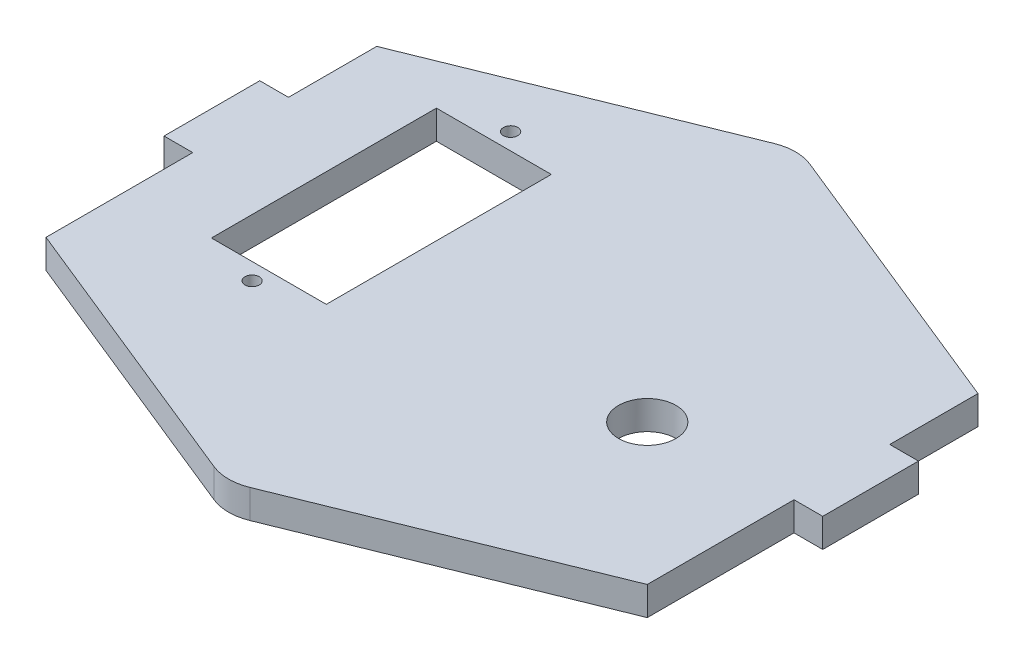
ISO-10303-21;
HEADER;
FILE_DESCRIPTION(('STEP AP214'),'2;1');
FILE_NAME('part.step','',(''),(''),'','','');
FILE_SCHEMA(('AUTOMOTIVE_DESIGN { 1 0 10303 214 1 1 1 1 }'));
ENDSEC;
DATA;
#1=APPLICATION_CONTEXT('core data for automotive mechanical design processes');
#2=APPLICATION_PROTOCOL_DEFINITION('international standard','automotive_design',2000,#1);
#3=PRODUCT_CONTEXT('',#1,'mechanical');
#4=PRODUCT('Part','Part','',(#3));
#5=PRODUCT_RELATED_PRODUCT_CATEGORY('part','',(#4));
#6=PRODUCT_DEFINITION_FORMATION('','',#4);
#7=PRODUCT_DEFINITION_CONTEXT('part definition',#1,'design');
#8=PRODUCT_DEFINITION('design','',#6,#7);
#9=PRODUCT_DEFINITION_SHAPE('','',#8);
#10=(LENGTH_UNIT() NAMED_UNIT(*) SI_UNIT(.MILLI.,.METRE.));
#11=(NAMED_UNIT(*) PLANE_ANGLE_UNIT() SI_UNIT($,.RADIAN.));
#12=(NAMED_UNIT(*) SI_UNIT($,.STERADIAN.) SOLID_ANGLE_UNIT());
#13=UNCERTAINTY_MEASURE_WITH_UNIT(LENGTH_MEASURE(1.E-05),#10,'distance_accuracy_value','');
#14=(GEOMETRIC_REPRESENTATION_CONTEXT(3) GLOBAL_UNCERTAINTY_ASSIGNED_CONTEXT((#13)) GLOBAL_UNIT_ASSIGNED_CONTEXT((#10,
#11,#12)) REPRESENTATION_CONTEXT('',''));
#15=CARTESIAN_POINT('',(0.,0.,0.));
#16=DIRECTION('',(0.,0.,1.));
#17=DIRECTION('',(1.,0.,0.));
#18=AXIS2_PLACEMENT_3D('',#15,#16,#17);
#19=CARTESIAN_POINT('',(31.4,-0.01,-16.055));
#20=DIRECTION('',(-1.,0.,0.));
#21=DIRECTION('',(0.,0.,1.));
#22=AXIS2_PLACEMENT_3D('',#19,#20,#21);
#23=PLANE('',#22);
#24=DIRECTION('',(0.,0.,1.));
#25=VECTOR('',#24,1.);
#26=CARTESIAN_POINT('',(31.4,0.,-16.055));
#27=LINE('',#26,#25);
#28=CARTESIAN_POINT('',(31.4,0.,-17.2711337209302));
#29=VERTEX_POINT('',#28);
#30=CARTESIAN_POINT('',(31.4,0.,-8.05500000000001));
#31=VERTEX_POINT('',#30);
#32=EDGE_CURVE('E279',#29,#31,#27,.T.);
#33=ORIENTED_EDGE('',*,*,#32,.F.);
#34=DIRECTION('',(0.,-1.,0.));
#35=VECTOR('',#34,1.);
#36=CARTESIAN_POINT('',(31.4,3.,-17.2711337209302));
#37=LINE('',#36,#35);
#38=CARTESIAN_POINT('',(31.4,3.,-17.2711337209302));
#39=VERTEX_POINT('',#38);
#40=EDGE_CURVE('E200',#39,#29,#37,.T.);
#41=ORIENTED_EDGE('',*,*,#40,.F.);
#42=DIRECTION('',(0.,0.,1.));
#43=VECTOR('',#42,1.);
#44=CARTESIAN_POINT('',(31.4,3.,-16.055));
#45=LINE('',#44,#43);
#46=CARTESIAN_POINT('',(31.4,3.,-8.05500000000001));
#47=VERTEX_POINT('',#46);
#48=EDGE_CURVE('E278',#39,#47,#45,.T.);
#49=ORIENTED_EDGE('',*,*,#48,.T.);
#50=DIRECTION('',(0.,1.,0.));
#51=VECTOR('',#50,1.);
#52=CARTESIAN_POINT('',(31.4,0.,-8.05500000000001));
#53=LINE('',#52,#51);
#54=EDGE_CURVE('E270',#31,#47,#53,.T.);
#55=ORIENTED_EDGE('',*,*,#54,.F.);
#56=EDGE_LOOP('',(#33,#41,#49,#55));
#57=FACE_BOUND('',#56,.T.);
#58=ADVANCED_FACE('F34',(#57),#23,.F.);
#59=CARTESIAN_POINT('',(31.4,-0.01,17.2711337209302));
#60=DIRECTION('',(-1.,0.,0.));
#61=DIRECTION('',(0.,0.,1.));
#62=AXIS2_PLACEMENT_3D('',#59,#60,#61);
#63=PLANE('',#62);
#64=DIRECTION('',(0.,1.,0.));
#65=VECTOR('',#64,1.);
#66=CARTESIAN_POINT('',(31.4,-0.01,17.2711337209302));
#67=LINE('',#66,#65);
#68=CARTESIAN_POINT('',(31.4,0.,17.2711337209302));
#69=VERTEX_POINT('',#68);
#70=CARTESIAN_POINT('',(31.4,3.,17.2711337209302));
#71=VERTEX_POINT('',#70);
#72=EDGE_CURVE('E193',#69,#71,#67,.T.);
#73=ORIENTED_EDGE('',*,*,#72,.F.);
#74=DIRECTION('',(0.,0.,1.));
#75=VECTOR('',#74,1.);
#76=CARTESIAN_POINT('',(31.4,0.,16.055));
#77=LINE('',#76,#75);
#78=CARTESIAN_POINT('',(31.4,0.,1.94499999999999));
#79=VERTEX_POINT('',#78);
#80=EDGE_CURVE('E179',#79,#69,#77,.T.);
#81=ORIENTED_EDGE('',*,*,#80,.F.);
#82=DIRECTION('',(0.,1.,0.));
#83=VECTOR('',#82,1.);
#84=CARTESIAN_POINT('',(31.4,0.,1.94499999999999));
#85=LINE('',#84,#83);
#86=CARTESIAN_POINT('',(31.4,3.,1.94499999999999));
#87=VERTEX_POINT('',#86);
#88=EDGE_CURVE('E282',#79,#87,#85,.T.);
#89=ORIENTED_EDGE('',*,*,#88,.T.);
#90=DIRECTION('',(0.,0.,1.));
#91=VECTOR('',#90,1.);
#92=CARTESIAN_POINT('',(31.4,3.,16.055));
#93=LINE('',#92,#91);
#94=EDGE_CURVE('E196',#87,#71,#93,.T.);
#95=ORIENTED_EDGE('',*,*,#94,.T.);
#96=EDGE_LOOP('',(#73,#81,#89,#95));
#97=FACE_BOUND('',#96,.T.);
#98=ADVANCED_FACE('F194',(#97),#63,.F.);
#99=CARTESIAN_POINT('',(-31.4,-0.01,17.2711337209302));
#100=DIRECTION('',(1.,0.,0.));
#101=DIRECTION('',(0.,0.,-1.));
#102=AXIS2_PLACEMENT_3D('',#99,#100,#101);
#103=PLANE('',#102);
#104=DIRECTION('',(0.,0.,-1.));
#105=VECTOR('',#104,1.);
#106=CARTESIAN_POINT('',(-31.4,0.,16.055));
#107=LINE('',#106,#105);
#108=CARTESIAN_POINT('',(-31.4,0.,17.2711337209302));
#109=VERTEX_POINT('',#108);
#110=CARTESIAN_POINT('',(-31.4,0.,1.94499999999999));
#111=VERTEX_POINT('',#110);
#112=EDGE_CURVE('E303',#109,#111,#107,.T.);
#113=ORIENTED_EDGE('',*,*,#112,.F.);
#114=DIRECTION('',(0.,1.,0.));
#115=VECTOR('',#114,1.);
#116=CARTESIAN_POINT('',(-31.4,-0.01,17.2711337209302));
#117=LINE('',#116,#115);
#118=CARTESIAN_POINT('',(-31.4,3.,17.2711337209302));
#119=VERTEX_POINT('',#118);
#120=EDGE_CURVE('E201',#109,#119,#117,.T.);
#121=ORIENTED_EDGE('',*,*,#120,.T.);
#122=DIRECTION('',(0.,0.,-1.));
#123=VECTOR('',#122,1.);
#124=CARTESIAN_POINT('',(-31.4,3.,16.055));
#125=LINE('',#124,#123);
#126=CARTESIAN_POINT('',(-31.4,3.,1.94499999999999));
#127=VERTEX_POINT('',#126);
#128=EDGE_CURVE('E302',#119,#127,#125,.T.);
#129=ORIENTED_EDGE('',*,*,#128,.T.);
#130=DIRECTION('',(0.,1.,0.));
#131=VECTOR('',#130,1.);
#132=CARTESIAN_POINT('',(-31.4,0.,1.94499999999999));
#133=LINE('',#132,#131);
#134=EDGE_CURVE('E294',#111,#127,#133,.T.);
#135=ORIENTED_EDGE('',*,*,#134,.F.);
#136=EDGE_LOOP('',(#113,#121,#129,#135));
#137=FACE_BOUND('',#136,.T.);
#138=ADVANCED_FACE('F400',(#137),#103,.F.);
#139=CARTESIAN_POINT('',(-31.4,-0.01,-16.055));
#140=DIRECTION('',(1.,0.,0.));
#141=DIRECTION('',(0.,0.,-1.));
#142=AXIS2_PLACEMENT_3D('',#139,#140,#141);
#143=PLANE('',#142);
#144=DIRECTION('',(0.,1.,0.));
#145=VECTOR('',#144,1.);
#146=CARTESIAN_POINT('',(-31.4,-0.01,-17.2711337209302));
#147=LINE('',#146,#145);
#148=CARTESIAN_POINT('',(-31.4,0.,-17.2711337209302));
#149=VERTEX_POINT('',#148);
#150=CARTESIAN_POINT('',(-31.4,3.,-17.2711337209302));
#151=VERTEX_POINT('',#150);
#152=EDGE_CURVE('E229',#149,#151,#147,.T.);
#153=ORIENTED_EDGE('',*,*,#152,.F.);
#154=DIRECTION('',(0.,0.,-1.));
#155=VECTOR('',#154,1.);
#156=CARTESIAN_POINT('',(-31.4,0.,-16.055));
#157=LINE('',#156,#155);
#158=CARTESIAN_POINT('',(-31.4,0.,-8.05500000000001));
#159=VERTEX_POINT('',#158);
#160=EDGE_CURVE('E313',#159,#149,#157,.T.);
#161=ORIENTED_EDGE('',*,*,#160,.F.);
#162=DIRECTION('',(0.,1.,0.));
#163=VECTOR('',#162,1.);
#164=CARTESIAN_POINT('',(-31.4,0.,-8.05500000000001));
#165=LINE('',#164,#163);
#166=CARTESIAN_POINT('',(-31.4,3.,-8.05500000000001));
#167=VERTEX_POINT('',#166);
#168=EDGE_CURVE('E306',#159,#167,#165,.T.);
#169=ORIENTED_EDGE('',*,*,#168,.T.);
#170=DIRECTION('',(0.,0.,-1.));
#171=VECTOR('',#170,1.);
#172=CARTESIAN_POINT('',(-31.4,3.,-16.055));
#173=LINE('',#172,#171);
#174=EDGE_CURVE('E315',#167,#151,#173,.T.);
#175=ORIENTED_EDGE('',*,*,#174,.T.);
#176=EDGE_LOOP('',(#153,#161,#169,#175));
#177=FACE_BOUND('',#176,.T.);
#178=ADVANCED_FACE('F370',(#177),#143,.F.);
#179=CARTESIAN_POINT('',(-10.7,0.,-14.805));
#180=DIRECTION('',(0.,0.,-1.));
#181=DIRECTION('',(-1.,0.,0.));
#182=AXIS2_PLACEMENT_3D('',#179,#180,#181);
#183=PLANE('',#182);
#184=DIRECTION('',(-1.,0.,0.));
#185=VECTOR('',#184,1.);
#186=CARTESIAN_POINT('',(-10.7,3.,-14.805));
#187=LINE('',#186,#185);
#188=CARTESIAN_POINT('',(-10.7,3.,-14.805));
#189=VERTEX_POINT('',#188);
#190=CARTESIAN_POINT('',(-22.7,3.,-14.805));
#191=VERTEX_POINT('',#190);
#192=EDGE_CURVE('E329',#189,#191,#187,.T.);
#193=ORIENTED_EDGE('',*,*,#192,.T.);
#194=DIRECTION('',(0.,1.,0.));
#195=VECTOR('',#194,1.);
#196=CARTESIAN_POINT('',(-22.7,0.,-14.805));
#197=LINE('',#196,#195);
#198=CARTESIAN_POINT('',(-22.7,0.,-14.805));
#199=VERTEX_POINT('',#198);
#200=EDGE_CURVE('E75',#199,#191,#197,.T.);
#201=ORIENTED_EDGE('',*,*,#200,.F.);
#202=DIRECTION('',(-1.,0.,0.));
#203=VECTOR('',#202,1.);
#204=CARTESIAN_POINT('',(-10.7,0.,-14.805));
#205=LINE('',#204,#203);
#206=CARTESIAN_POINT('',(-10.7,0.,-14.805));
#207=VERTEX_POINT('',#206);
#208=EDGE_CURVE('E325',#207,#199,#205,.T.);
#209=ORIENTED_EDGE('',*,*,#208,.F.);
#210=DIRECTION('',(0.,1.,0.));
#211=VECTOR('',#210,1.);
#212=CARTESIAN_POINT('',(-10.7,0.,-14.805));
#213=LINE('',#212,#211);
#214=EDGE_CURVE('E65',#207,#189,#213,.T.);
#215=ORIENTED_EDGE('',*,*,#214,.T.);
#216=EDGE_LOOP('',(#193,#201,#209,#215));
#217=FACE_BOUND('',#216,.T.);
#218=ADVANCED_FACE('F462',(#217),#183,.F.);
#219=CARTESIAN_POINT('',(-10.7,0.,8.69499999999999));
#220=DIRECTION('',(1.,0.,0.));
#221=DIRECTION('',(0.,0.,-1.));
#222=AXIS2_PLACEMENT_3D('',#219,#220,#221);
#223=PLANE('',#222);
#224=DIRECTION('',(0.,0.,-1.));
#225=VECTOR('',#224,1.);
#226=CARTESIAN_POINT('',(-10.7,3.,8.69499999999999));
#227=LINE('',#226,#225);
#228=CARTESIAN_POINT('',(-10.7,3.,8.69499999999999));
#229=VERTEX_POINT('',#228);
#230=EDGE_CURVE('E331',#229,#189,#227,.T.);
#231=ORIENTED_EDGE('',*,*,#230,.T.);
#232=ORIENTED_EDGE('',*,*,#214,.F.);
#233=DIRECTION('',(0.,0.,-1.));
#234=VECTOR('',#233,1.);
#235=CARTESIAN_POINT('',(-10.7,0.,8.69499999999999));
#236=LINE('',#235,#234);
#237=CARTESIAN_POINT('',(-10.7,0.,8.69499999999999));
#238=VERTEX_POINT('',#237);
#239=EDGE_CURVE('E341',#238,#207,#236,.T.);
#240=ORIENTED_EDGE('',*,*,#239,.F.);
#241=DIRECTION('',(0.,1.,0.));
#242=VECTOR('',#241,1.);
#243=CARTESIAN_POINT('',(-10.7,0.,8.69499999999999));
#244=LINE('',#243,#242);
#245=EDGE_CURVE('E53',#238,#229,#244,.T.);
#246=ORIENTED_EDGE('',*,*,#245,.T.);
#247=EDGE_LOOP('',(#231,#232,#240,#246));
#248=FACE_BOUND('',#247,.T.);
#249=ADVANCED_FACE('F458',(#248),#223,.F.);
#250=CARTESIAN_POINT('',(-10.7,0.,8.69499999999999));
#251=DIRECTION('',(0.,0.,1.));
#252=DIRECTION('',(1.,0.,0.));
#253=AXIS2_PLACEMENT_3D('',#250,#251,#252);
#254=PLANE('',#253);
#255=DIRECTION('',(1.,0.,0.));
#256=VECTOR('',#255,1.);
#257=CARTESIAN_POINT('',(-10.7,3.,8.69499999999999));
#258=LINE('',#257,#256);
#259=CARTESIAN_POINT('',(-22.7,3.,8.69499999999999));
#260=VERTEX_POINT('',#259);
#261=EDGE_CURVE('E334',#260,#229,#258,.T.);
#262=ORIENTED_EDGE('',*,*,#261,.T.);
#263=ORIENTED_EDGE('',*,*,#245,.F.);
#264=DIRECTION('',(1.,0.,0.));
#265=VECTOR('',#264,1.);
#266=CARTESIAN_POINT('',(-10.7,0.,8.69499999999999));
#267=LINE('',#266,#265);
#268=CARTESIAN_POINT('',(-22.7,0.,8.69499999999999));
#269=VERTEX_POINT('',#268);
#270=EDGE_CURVE('E344',#269,#238,#267,.T.);
#271=ORIENTED_EDGE('',*,*,#270,.F.);
#272=DIRECTION('',(0.,1.,0.));
#273=VECTOR('',#272,1.);
#274=CARTESIAN_POINT('',(-22.7,0.,8.69499999999999));
#275=LINE('',#274,#273);
#276=EDGE_CURVE('E72',#269,#260,#275,.T.);
#277=ORIENTED_EDGE('',*,*,#276,.T.);
#278=EDGE_LOOP('',(#262,#263,#271,#277));
#279=FACE_BOUND('',#278,.T.);
#280=ADVANCED_FACE('F455',(#279),#254,.F.);
#281=CARTESIAN_POINT('',(-22.7,0.,8.69499999999999));
#282=DIRECTION('',(-1.,0.,0.));
#283=DIRECTION('',(0.,0.,1.));
#284=AXIS2_PLACEMENT_3D('',#281,#282,#283);
#285=PLANE('',#284);
#286=DIRECTION('',(0.,0.,1.));
#287=VECTOR('',#286,1.);
#288=CARTESIAN_POINT('',(-22.7,3.,8.69499999999999));
#289=LINE('',#288,#287);
#290=EDGE_CURVE('E336',#191,#260,#289,.T.);
#291=ORIENTED_EDGE('',*,*,#290,.T.);
#292=ORIENTED_EDGE('',*,*,#276,.F.);
#293=DIRECTION('',(0.,0.,1.));
#294=VECTOR('',#293,1.);
#295=CARTESIAN_POINT('',(-22.7,0.,8.69499999999999));
#296=LINE('',#295,#294);
#297=EDGE_CURVE('E332',#199,#269,#296,.T.);
#298=ORIENTED_EDGE('',*,*,#297,.F.);
#299=ORIENTED_EDGE('',*,*,#200,.T.);
#300=EDGE_LOOP('',(#291,#292,#298,#299));
#301=FACE_BOUND('',#300,.T.);
#302=ADVANCED_FACE('F452',(#301),#285,.F.);
#303=CARTESIAN_POINT('',(-16.7,0.,-16.555));
#304=DIRECTION('',(0.,1.,0.));
#305=DIRECTION('',(0.,0.,1.));
#306=AXIS2_PLACEMENT_3D('',#303,#304,#305);
#307=CYLINDRICAL_SURFACE('',#306,0.750000000000002);
#308=CARTESIAN_POINT('',(-16.7,0.,-16.555));
#309=DIRECTION('',(0.,1.,0.));
#310=DIRECTION('',(0.,0.,1.));
#311=AXIS2_PLACEMENT_3D('',#308,#309,#310);
#312=CIRCLE('',#311,0.750000000000002);
#313=CARTESIAN_POINT('',(-16.7,0.,-15.805));
#314=VERTEX_POINT('',#313);
#315=EDGE_CURVE('E338',#314,#314,#312,.T.);
#316=ORIENTED_EDGE('',*,*,#315,.F.);
#317=EDGE_LOOP('',(#316));
#318=FACE_BOUND('',#317,.T.);
#319=CARTESIAN_POINT('',(-16.7,3.,-16.555));
#320=DIRECTION('',(0.,1.,0.));
#321=DIRECTION('',(0.,0.,1.));
#322=AXIS2_PLACEMENT_3D('',#319,#320,#321);
#323=CIRCLE('',#322,0.750000000000002);
#324=CARTESIAN_POINT('',(-16.7,3.,-15.805));
#325=VERTEX_POINT('',#324);
#326=EDGE_CURVE('E349',#325,#325,#323,.T.);
#327=ORIENTED_EDGE('',*,*,#326,.T.);
#328=EDGE_LOOP('',(#327));
#329=FACE_BOUND('',#328,.T.);
#330=ADVANCED_FACE('F361',(#318,#329),#307,.F.);
#331=CARTESIAN_POINT('',(-16.7,0.,10.445));
#332=DIRECTION('',(0.,1.,0.));
#333=DIRECTION('',(0.,0.,1.));
#334=AXIS2_PLACEMENT_3D('',#331,#332,#333);
#335=CYLINDRICAL_SURFACE('',#334,0.750000000000002);
#336=CARTESIAN_POINT('',(-16.7,0.,10.445));
#337=DIRECTION('',(0.,1.,0.));
#338=DIRECTION('',(0.,0.,-1.));
#339=AXIS2_PLACEMENT_3D('',#336,#337,#338);
#340=CIRCLE('',#339,0.750000000000002);
#341=CARTESIAN_POINT('',(-16.7,0.,9.69499999999999));
#342=VERTEX_POINT('',#341);
#343=EDGE_CURVE('E44',#342,#342,#340,.T.);
#344=ORIENTED_EDGE('',*,*,#343,.F.);
#345=EDGE_LOOP('',(#344));
#346=FACE_BOUND('',#345,.T.);
#347=CARTESIAN_POINT('',(-16.7,3.,10.445));
#348=DIRECTION('',(0.,1.,0.));
#349=DIRECTION('',(0.,0.,-1.));
#350=AXIS2_PLACEMENT_3D('',#347,#348,#349);
#351=CIRCLE('',#350,0.750000000000002);
#352=CARTESIAN_POINT('',(-16.7,3.,9.69499999999999));
#353=VERTEX_POINT('',#352);
#354=EDGE_CURVE('E11',#353,#353,#351,.T.);
#355=ORIENTED_EDGE('',*,*,#354,.T.);
#356=EDGE_LOOP('',(#355));
#357=FACE_BOUND('',#356,.T.);
#358=ADVANCED_FACE('F358',(#346,#357),#335,.F.);
#359=CARTESIAN_POINT('',(0.,3.,-30.));
#360=DIRECTION('',(-0.375683221710316,0.,0.926748141042299));
#361=DIRECTION('',(0.9267481410423,0.,0.375683221710316));
#362=AXIS2_PLACEMENT_3D('',#359,#360,#361);
#363=PLANE('',#362);
#364=DIRECTION('',(-0.926748141042299,0.,-0.375683221710316));
#365=VECTOR('',#364,1.);
#366=CARTESIAN_POINT('',(0.,3.,-30.));
#367=LINE('',#366,#365);
#368=CARTESIAN_POINT('',(1.8784161085516,3.,-29.238531609484));
#369=VERTEX_POINT('',#368);
#370=EDGE_CURVE('E38',#39,#369,#367,.T.);
#371=ORIENTED_EDGE('',*,*,#370,.F.);
#372=ORIENTED_EDGE('',*,*,#40,.T.);
#373=DIRECTION('',(-0.926748141042299,0.,-0.375683221710316));
#374=VECTOR('',#373,1.);
#375=CARTESIAN_POINT('',(0.,0.,-30.));
#376=LINE('',#375,#374);
#377=CARTESIAN_POINT('',(1.8784161085516,0.,-29.238531609484));
#378=VERTEX_POINT('',#377);
#379=EDGE_CURVE('E212',#29,#378,#376,.T.);
#380=ORIENTED_EDGE('',*,*,#379,.T.);
#381=DIRECTION('',(0.,-1.,0.));
#382=VECTOR('',#381,1.);
#383=CARTESIAN_POINT('',(1.8784161085516,3.,-29.238531609484));
#384=LINE('',#383,#382);
#385=EDGE_CURVE('E231',#378,#369,#384,.F.);
#386=ORIENTED_EDGE('',*,*,#385,.T.);
#387=EDGE_LOOP('',(#371,#372,#380,#386));
#388=FACE_BOUND('',#387,.T.);
#389=ADVANCED_FACE('F237',(#388),#363,.F.);
#390=CARTESIAN_POINT('',(0.,3.,-24.6047909042725));
#391=DIRECTION('',(0.,-1.,0.));
#392=DIRECTION('',(0.,0.,-1.));
#393=AXIS2_PLACEMENT_3D('',#390,#391,#392);
#394=CYLINDRICAL_SURFACE('',#393,5.);
#395=CARTESIAN_POINT('',(0.,3.,-24.6047909042725));
#396=DIRECTION('',(0.,-1.,0.));
#397=DIRECTION('',(0.,0.,-1.));
#398=AXIS2_PLACEMENT_3D('',#395,#396,#397);
#399=CIRCLE('',#398,5.);
#400=CARTESIAN_POINT('',(-1.87841610855156,3.,-29.238531609484));
#401=VERTEX_POINT('',#400);
#402=EDGE_CURVE('E250',#369,#401,#399,.F.);
#403=ORIENTED_EDGE('',*,*,#402,.F.);
#404=ORIENTED_EDGE('',*,*,#385,.F.);
#405=CARTESIAN_POINT('',(0.,0.,-24.6047909042725));
#406=DIRECTION('',(0.,-1.,0.));
#407=DIRECTION('',(0.,0.,-1.));
#408=AXIS2_PLACEMENT_3D('',#405,#406,#407);
#409=CIRCLE('',#408,5.);
#410=CARTESIAN_POINT('',(-1.87841610855156,0.,-29.238531609484));
#411=VERTEX_POINT('',#410);
#412=EDGE_CURVE('E243',#411,#378,#409,.T.);
#413=ORIENTED_EDGE('',*,*,#412,.F.);
#414=DIRECTION('',(0.,-1.,0.));
#415=VECTOR('',#414,1.);
#416=CARTESIAN_POINT('',(-1.87841610855156,3.,-29.238531609484));
#417=LINE('',#416,#415);
#418=EDGE_CURVE('E251',#401,#411,#417,.T.);
#419=ORIENTED_EDGE('',*,*,#418,.F.);
#420=EDGE_LOOP('',(#403,#404,#413,#419));
#421=FACE_BOUND('',#420,.T.);
#422=ADVANCED_FACE('F249',(#421),#394,.T.);
#423=CARTESIAN_POINT('',(-34.4,3.,-16.055));
#424=DIRECTION('',(0.375683221710316,0.,0.926748141042299));
#425=DIRECTION('',(0.926748141042299,0.,-0.375683221710316));
#426=AXIS2_PLACEMENT_3D('',#423,#424,#425);
#427=PLANE('',#426);
#428=DIRECTION('',(-0.926748141042299,0.,0.375683221710316));
#429=VECTOR('',#428,1.);
#430=CARTESIAN_POINT('',(-34.4,0.,-16.055));
#431=LINE('',#430,#429);
#432=EDGE_CURVE('E223',#411,#149,#431,.T.);
#433=ORIENTED_EDGE('',*,*,#432,.T.);
#434=ORIENTED_EDGE('',*,*,#152,.T.);
#435=DIRECTION('',(-0.926748141042299,0.,0.375683221710316));
#436=VECTOR('',#435,1.);
#437=CARTESIAN_POINT('',(-34.4,3.,-16.055));
#438=LINE('',#437,#436);
#439=EDGE_CURVE('E226',#401,#151,#438,.T.);
#440=ORIENTED_EDGE('',*,*,#439,.F.);
#441=ORIENTED_EDGE('',*,*,#418,.T.);
#442=EDGE_LOOP('',(#433,#434,#440,#441));
#443=FACE_BOUND('',#442,.T.);
#444=ADVANCED_FACE('F420',(#443),#427,.F.);
#445=CARTESIAN_POINT('',(-34.4,3.,16.055));
#446=DIRECTION('',(1.,0.,0.));
#447=DIRECTION('',(0.,0.,-1.));
#448=AXIS2_PLACEMENT_3D('',#445,#446,#447);
#449=PLANE('',#448);
#450=DIRECTION('',(0.,0.,1.));
#451=VECTOR('',#450,1.);
#452=CARTESIAN_POINT('',(-34.4,3.,16.055));
#453=LINE('',#452,#451);
#454=CARTESIAN_POINT('',(-34.4,3.,-8.05500000000001));
#455=VERTEX_POINT('',#454);
#456=CARTESIAN_POINT('',(-34.4,3.,1.94499999999999));
#457=VERTEX_POINT('',#456);
#458=EDGE_CURVE('E219',#455,#457,#453,.T.);
#459=ORIENTED_EDGE('',*,*,#458,.F.);
#460=DIRECTION('',(0.,1.,0.));
#461=VECTOR('',#460,1.);
#462=CARTESIAN_POINT('',(-34.4,0.,-8.05500000000001));
#463=LINE('',#462,#461);
#464=CARTESIAN_POINT('',(-34.4,0.,-8.05500000000001));
#465=VERTEX_POINT('',#464);
#466=EDGE_CURVE('E311',#465,#455,#463,.T.);
#467=ORIENTED_EDGE('',*,*,#466,.F.);
#468=DIRECTION('',(0.,0.,1.));
#469=VECTOR('',#468,1.);
#470=CARTESIAN_POINT('',(-34.4,0.,16.055));
#471=LINE('',#470,#469);
#472=CARTESIAN_POINT('',(-34.4,0.,1.94499999999999));
#473=VERTEX_POINT('',#472);
#474=EDGE_CURVE('E210',#465,#473,#471,.T.);
#475=ORIENTED_EDGE('',*,*,#474,.T.);
#476=DIRECTION('',(0.,1.,0.));
#477=VECTOR('',#476,1.);
#478=CARTESIAN_POINT('',(-34.4,0.,1.94499999999999));
#479=LINE('',#478,#477);
#480=EDGE_CURVE('E291',#473,#457,#479,.T.);
#481=ORIENTED_EDGE('',*,*,#480,.T.);
#482=EDGE_LOOP('',(#459,#467,#475,#481));
#483=FACE_BOUND('',#482,.T.);
#484=ADVANCED_FACE('F410',(#483),#449,.F.);
#485=CARTESIAN_POINT('',(-34.4,3.,16.055));
#486=DIRECTION('',(0.375683221710316,0.,-0.9267481410423));
#487=DIRECTION('',(-0.9267481410423,0.,-0.375683221710316));
#488=AXIS2_PLACEMENT_3D('',#485,#486,#487);
#489=PLANE('',#488);
#490=ORIENTED_EDGE('',*,*,#120,.F.);
#491=DIRECTION('',(0.926748141042299,0.,0.375683221710316));
#492=VECTOR('',#491,1.);
#493=CARTESIAN_POINT('',(-34.4,0.,16.055));
#494=LINE('',#493,#492);
#495=CARTESIAN_POINT('',(-1.87841610855156,0.,29.238531609484));
#496=VERTEX_POINT('',#495);
#497=EDGE_CURVE('E207',#109,#496,#494,.T.);
#498=ORIENTED_EDGE('',*,*,#497,.T.);
#499=DIRECTION('',(0.,-1.,0.));
#500=VECTOR('',#499,1.);
#501=CARTESIAN_POINT('',(-1.87841610855155,3.,29.238531609484));
#502=LINE('',#501,#500);
#503=CARTESIAN_POINT('',(-1.87841610855156,3.,29.238531609484));
#504=VERTEX_POINT('',#503);
#505=EDGE_CURVE('E260',#496,#504,#502,.F.);
#506=ORIENTED_EDGE('',*,*,#505,.T.);
#507=DIRECTION('',(0.926748141042299,0.,0.375683221710316));
#508=VECTOR('',#507,1.);
#509=CARTESIAN_POINT('',(-34.4,3.,16.055));
#510=LINE('',#509,#508);
#511=EDGE_CURVE('E217',#119,#504,#510,.T.);
#512=ORIENTED_EDGE('',*,*,#511,.F.);
#513=EDGE_LOOP('',(#490,#498,#506,#512));
#514=FACE_BOUND('',#513,.T.);
#515=ADVANCED_FACE('F397',(#514),#489,.F.);
#516=CARTESIAN_POINT('',(0.,3.,24.6047909042725));
#517=DIRECTION('',(0.,-1.,0.));
#518=DIRECTION('',(0.,0.,-1.));
#519=AXIS2_PLACEMENT_3D('',#516,#517,#518);
#520=CYLINDRICAL_SURFACE('',#519,5.);
#521=CARTESIAN_POINT('',(0.,3.,24.6047909042725));
#522=DIRECTION('',(0.,-1.,0.));
#523=DIRECTION('',(0.,0.,-1.));
#524=AXIS2_PLACEMENT_3D('',#521,#522,#523);
#525=CIRCLE('',#524,5.);
#526=CARTESIAN_POINT('',(1.8784161085516,3.,29.238531609484));
#527=VERTEX_POINT('',#526);
#528=EDGE_CURVE('E253',#504,#527,#525,.F.);
#529=ORIENTED_EDGE('',*,*,#528,.F.);
#530=ORIENTED_EDGE('',*,*,#505,.F.);
#531=CARTESIAN_POINT('',(0.,0.,24.6047909042725));
#532=DIRECTION('',(0.,-1.,0.));
#533=DIRECTION('',(0.,0.,-1.));
#534=AXIS2_PLACEMENT_3D('',#531,#532,#533);
#535=CIRCLE('',#534,5.);
#536=CARTESIAN_POINT('',(1.8784161085516,0.,29.238531609484));
#537=VERTEX_POINT('',#536);
#538=EDGE_CURVE('E247',#537,#496,#535,.T.);
#539=ORIENTED_EDGE('',*,*,#538,.F.);
#540=DIRECTION('',(0.,-1.,0.));
#541=VECTOR('',#540,1.);
#542=CARTESIAN_POINT('',(1.8784161085516,3.,29.238531609484));
#543=LINE('',#542,#541);
#544=EDGE_CURVE('E206',#527,#537,#543,.T.);
#545=ORIENTED_EDGE('',*,*,#544,.F.);
#546=EDGE_LOOP('',(#529,#530,#539,#545));
#547=FACE_BOUND('',#546,.T.);
#548=ADVANCED_FACE('F392',(#547),#520,.T.);
#549=CARTESIAN_POINT('',(0.,3.,30.));
#550=DIRECTION('',(-0.375683221710316,0.,-0.926748141042299));
#551=DIRECTION('',(-0.926748141042299,0.,0.375683221710316));
#552=AXIS2_PLACEMENT_3D('',#549,#550,#551);
#553=PLANE('',#552);
#554=DIRECTION('',(0.926748141042299,0.,-0.375683221710316));
#555=VECTOR('',#554,1.);
#556=CARTESIAN_POINT('',(0.,0.,30.));
#557=LINE('',#556,#555);
#558=EDGE_CURVE('E185',#537,#69,#557,.T.);
#559=ORIENTED_EDGE('',*,*,#558,.T.);
#560=ORIENTED_EDGE('',*,*,#72,.T.);
#561=DIRECTION('',(0.926748141042299,0.,-0.375683221710316));
#562=VECTOR('',#561,1.);
#563=CARTESIAN_POINT('',(0.,3.,30.));
#564=LINE('',#563,#562);
#565=EDGE_CURVE('E215',#527,#71,#564,.T.);
#566=ORIENTED_EDGE('',*,*,#565,.F.);
#567=ORIENTED_EDGE('',*,*,#544,.T.);
#568=EDGE_LOOP('',(#559,#560,#566,#567));
#569=FACE_BOUND('',#568,.T.);
#570=ADVANCED_FACE('F204',(#569),#553,.F.);
#571=CARTESIAN_POINT('',(34.4,3.,16.055));
#572=DIRECTION('',(-1.,0.,0.));
#573=DIRECTION('',(0.,0.,1.));
#574=AXIS2_PLACEMENT_3D('',#571,#572,#573);
#575=PLANE('',#574);
#576=DIRECTION('',(0.,0.,-1.));
#577=VECTOR('',#576,1.);
#578=CARTESIAN_POINT('',(34.4,3.,16.055));
#579=LINE('',#578,#577);
#580=CARTESIAN_POINT('',(34.4,3.,1.94499999999999));
#581=VERTEX_POINT('',#580);
#582=CARTESIAN_POINT('',(34.4,3.,-8.05500000000001));
#583=VERTEX_POINT('',#582);
#584=EDGE_CURVE('E267',#581,#583,#579,.T.);
#585=ORIENTED_EDGE('',*,*,#584,.F.);
#586=DIRECTION('',(0.,1.,0.));
#587=VECTOR('',#586,1.);
#588=CARTESIAN_POINT('',(34.4,0.,1.94499999999999));
#589=LINE('',#588,#587);
#590=CARTESIAN_POINT('',(34.4,0.,1.94499999999999));
#591=VERTEX_POINT('',#590);
#592=EDGE_CURVE('E190',#591,#581,#589,.T.);
#593=ORIENTED_EDGE('',*,*,#592,.F.);
#594=DIRECTION('',(0.,0.,-1.));
#595=VECTOR('',#594,1.);
#596=CARTESIAN_POINT('',(34.4,0.,16.055));
#597=LINE('',#596,#595);
#598=CARTESIAN_POINT('',(34.4,0.,-8.05500000000001));
#599=VERTEX_POINT('',#598);
#600=EDGE_CURVE('E208',#591,#599,#597,.T.);
#601=ORIENTED_EDGE('',*,*,#600,.T.);
#602=DIRECTION('',(0.,1.,0.));
#603=VECTOR('',#602,1.);
#604=CARTESIAN_POINT('',(34.4,0.,-8.05500000000001));
#605=LINE('',#604,#603);
#606=EDGE_CURVE('E266',#599,#583,#605,.T.);
#607=ORIENTED_EDGE('',*,*,#606,.T.);
#608=EDGE_LOOP('',(#585,#593,#601,#607));
#609=FACE_BOUND('',#608,.T.);
#610=ADVANCED_FACE('F385',(#609),#575,.F.);
#611=CARTESIAN_POINT('',(34.4,0.,-8.05500000000001));
#612=DIRECTION('',(0.,0.,1.));
#613=DIRECTION('',(1.,0.,0.));
#614=AXIS2_PLACEMENT_3D('',#611,#612,#613);
#615=PLANE('',#614);
#616=DIRECTION('',(1.,0.,0.));
#617=VECTOR('',#616,1.);
#618=CARTESIAN_POINT('',(34.4,3.,-8.05500000000001));
#619=LINE('',#618,#617);
#620=EDGE_CURVE('E275',#47,#583,#619,.T.);
#621=ORIENTED_EDGE('',*,*,#620,.T.);
#622=ORIENTED_EDGE('',*,*,#606,.F.);
#623=DIRECTION('',(1.,0.,0.));
#624=VECTOR('',#623,1.);
#625=CARTESIAN_POINT('',(34.4,0.,-8.05500000000001));
#626=LINE('',#625,#624);
#627=EDGE_CURVE('E272',#31,#599,#626,.T.);
#628=ORIENTED_EDGE('',*,*,#627,.F.);
#629=ORIENTED_EDGE('',*,*,#54,.T.);
#630=EDGE_LOOP('',(#621,#622,#628,#629));
#631=FACE_BOUND('',#630,.T.);
#632=ADVANCED_FACE('F382',(#631),#615,.F.);
#633=CARTESIAN_POINT('',(34.4,0.,1.94499999999999));
#634=DIRECTION('',(0.,0.,-1.));
#635=DIRECTION('',(-1.,0.,0.));
#636=AXIS2_PLACEMENT_3D('',#633,#634,#635);
#637=PLANE('',#636);
#638=DIRECTION('',(-1.,0.,0.));
#639=VECTOR('',#638,1.);
#640=CARTESIAN_POINT('',(34.4,3.,1.94499999999999));
#641=LINE('',#640,#639);
#642=EDGE_CURVE('E289',#581,#87,#641,.T.);
#643=ORIENTED_EDGE('',*,*,#642,.T.);
#644=ORIENTED_EDGE('',*,*,#88,.F.);
#645=DIRECTION('',(-1.,0.,0.));
#646=VECTOR('',#645,1.);
#647=CARTESIAN_POINT('',(34.4,0.,1.94499999999999));
#648=LINE('',#647,#646);
#649=EDGE_CURVE('E187',#591,#79,#648,.T.);
#650=ORIENTED_EDGE('',*,*,#649,.F.);
#651=ORIENTED_EDGE('',*,*,#592,.T.);
#652=EDGE_LOOP('',(#643,#644,#650,#651));
#653=FACE_BOUND('',#652,.T.);
#654=ADVANCED_FACE('F389',(#653),#637,.F.);
#655=CARTESIAN_POINT('',(-34.4,0.,1.94499999999999));
#656=DIRECTION('',(0.,0.,-1.));
#657=DIRECTION('',(-1.,0.,0.));
#658=AXIS2_PLACEMENT_3D('',#655,#656,#657);
#659=PLANE('',#658);
#660=DIRECTION('',(-1.,0.,0.));
#661=VECTOR('',#660,1.);
#662=CARTESIAN_POINT('',(-34.4,3.,1.94499999999999));
#663=LINE('',#662,#661);
#664=EDGE_CURVE('E299',#127,#457,#663,.T.);
#665=ORIENTED_EDGE('',*,*,#664,.T.);
#666=ORIENTED_EDGE('',*,*,#480,.F.);
#667=DIRECTION('',(-1.,0.,0.));
#668=VECTOR('',#667,1.);
#669=CARTESIAN_POINT('',(-34.4,0.,1.94499999999999));
#670=LINE('',#669,#668);
#671=EDGE_CURVE('E296',#111,#473,#670,.T.);
#672=ORIENTED_EDGE('',*,*,#671,.F.);
#673=ORIENTED_EDGE('',*,*,#134,.T.);
#674=EDGE_LOOP('',(#665,#666,#672,#673));
#675=FACE_BOUND('',#674,.T.);
#676=ADVANCED_FACE('F405',(#675),#659,.F.);
#677=CARTESIAN_POINT('',(-34.4,0.,-8.05500000000001));
#678=DIRECTION('',(0.,0.,1.));
#679=DIRECTION('',(1.,0.,0.));
#680=AXIS2_PLACEMENT_3D('',#677,#678,#679);
#681=PLANE('',#680);
#682=DIRECTION('',(1.,0.,0.));
#683=VECTOR('',#682,1.);
#684=CARTESIAN_POINT('',(-34.4,3.,-8.05500000000001));
#685=LINE('',#684,#683);
#686=EDGE_CURVE('E317',#455,#167,#685,.T.);
#687=ORIENTED_EDGE('',*,*,#686,.T.);
#688=ORIENTED_EDGE('',*,*,#168,.F.);
#689=DIRECTION('',(1.,0.,0.));
#690=VECTOR('',#689,1.);
#691=CARTESIAN_POINT('',(-34.4,0.,-8.05500000000001));
#692=LINE('',#691,#690);
#693=EDGE_CURVE('E318',#465,#159,#692,.T.);
#694=ORIENTED_EDGE('',*,*,#693,.F.);
#695=ORIENTED_EDGE('',*,*,#466,.T.);
#696=EDGE_LOOP('',(#687,#688,#694,#695));
#697=FACE_BOUND('',#696,.T.);
#698=ADVANCED_FACE('F413',(#697),#681,.F.);
#699=CARTESIAN_POINT('',(0.,0.,0.));
#700=DIRECTION('',(0.,-1.,0.));
#701=DIRECTION('',(0.,0.,-1.));
#702=AXIS2_PLACEMENT_3D('',#699,#700,#701);
#703=PLANE('',#702);
#704=CARTESIAN_POINT('',(16.7,0.,2.57113372093023));
#705=DIRECTION('',(0.,-1.,0.));
#706=DIRECTION('',(0.,0.,-1.));
#707=AXIS2_PLACEMENT_3D('',#704,#705,#706);
#708=CIRCLE('',#707,2.99999999999999);
#709=CARTESIAN_POINT('',(16.7,0.,-0.428866279069767));
#710=VERTEX_POINT('',#709);
#711=EDGE_CURVE('E222',#710,#710,#708,.T.);
#712=ORIENTED_EDGE('',*,*,#711,.F.);
#713=EDGE_LOOP('',(#712));
#714=FACE_BOUND('',#713,.T.);
#715=ORIENTED_EDGE('',*,*,#379,.F.);
#716=ORIENTED_EDGE('',*,*,#32,.T.);
#717=ORIENTED_EDGE('',*,*,#627,.T.);
#718=ORIENTED_EDGE('',*,*,#600,.F.);
#719=ORIENTED_EDGE('',*,*,#649,.T.);
#720=ORIENTED_EDGE('',*,*,#80,.T.);
#721=ORIENTED_EDGE('',*,*,#558,.F.);
#722=ORIENTED_EDGE('',*,*,#538,.T.);
#723=ORIENTED_EDGE('',*,*,#497,.F.);
#724=ORIENTED_EDGE('',*,*,#112,.T.);
#725=ORIENTED_EDGE('',*,*,#671,.T.);
#726=ORIENTED_EDGE('',*,*,#474,.F.);
#727=ORIENTED_EDGE('',*,*,#693,.T.);
#728=ORIENTED_EDGE('',*,*,#160,.T.);
#729=ORIENTED_EDGE('',*,*,#432,.F.);
#730=ORIENTED_EDGE('',*,*,#412,.T.);
#731=EDGE_LOOP('',(#715,#716,#717,#718,#719,#720,#721,#722,#723,#724,#725,#726,#727,#728,#729,#730));
#732=FACE_BOUND('',#731,.T.);
#733=ORIENTED_EDGE('',*,*,#343,.T.);
#734=EDGE_LOOP('',(#733));
#735=FACE_BOUND('',#734,.T.);
#736=ORIENTED_EDGE('',*,*,#315,.T.);
#737=EDGE_LOOP('',(#736));
#738=FACE_BOUND('',#737,.T.);
#739=ORIENTED_EDGE('',*,*,#297,.T.);
#740=ORIENTED_EDGE('',*,*,#270,.T.);
#741=ORIENTED_EDGE('',*,*,#239,.T.);
#742=ORIENTED_EDGE('',*,*,#208,.T.);
#743=EDGE_LOOP('',(#739,#740,#741,#742));
#744=FACE_BOUND('',#743,.T.);
#745=ADVANCED_FACE('F36',(#714,#732,#735,#738,#744),#703,.T.);
#746=CARTESIAN_POINT('',(0.,3.,0.));
#747=DIRECTION('',(0.,-1.,0.));
#748=DIRECTION('',(0.,0.,-1.));
#749=AXIS2_PLACEMENT_3D('',#746,#747,#748);
#750=PLANE('',#749);
#751=CARTESIAN_POINT('',(16.7,3.,2.57113372093023));
#752=DIRECTION('',(0.,1.,0.));
#753=DIRECTION('',(0.,0.,1.));
#754=AXIS2_PLACEMENT_3D('',#751,#752,#753);
#755=CIRCLE('',#754,2.99999999999999);
#756=CARTESIAN_POINT('',(16.7,3.,5.57113372093022));
#757=VERTEX_POINT('',#756);
#758=EDGE_CURVE('E628',#757,#757,#755,.T.);
#759=ORIENTED_EDGE('',*,*,#758,.F.);
#760=EDGE_LOOP('',(#759));
#761=FACE_BOUND('',#760,.T.);
#762=ORIENTED_EDGE('',*,*,#354,.F.);
#763=EDGE_LOOP('',(#762));
#764=FACE_BOUND('',#763,.T.);
#765=ORIENTED_EDGE('',*,*,#326,.F.);
#766=EDGE_LOOP('',(#765));
#767=FACE_BOUND('',#766,.T.);
#768=ORIENTED_EDGE('',*,*,#261,.F.);
#769=ORIENTED_EDGE('',*,*,#290,.F.);
#770=ORIENTED_EDGE('',*,*,#192,.F.);
#771=ORIENTED_EDGE('',*,*,#230,.F.);
#772=EDGE_LOOP('',(#768,#769,#770,#771));
#773=FACE_BOUND('',#772,.T.);
#774=ORIENTED_EDGE('',*,*,#48,.F.);
#775=ORIENTED_EDGE('',*,*,#370,.T.);
#776=ORIENTED_EDGE('',*,*,#402,.T.);
#777=ORIENTED_EDGE('',*,*,#439,.T.);
#778=ORIENTED_EDGE('',*,*,#174,.F.);
#779=ORIENTED_EDGE('',*,*,#686,.F.);
#780=ORIENTED_EDGE('',*,*,#458,.T.);
#781=ORIENTED_EDGE('',*,*,#664,.F.);
#782=ORIENTED_EDGE('',*,*,#128,.F.);
#783=ORIENTED_EDGE('',*,*,#511,.T.);
#784=ORIENTED_EDGE('',*,*,#528,.T.);
#785=ORIENTED_EDGE('',*,*,#565,.T.);
#786=ORIENTED_EDGE('',*,*,#94,.F.);
#787=ORIENTED_EDGE('',*,*,#642,.F.);
#788=ORIENTED_EDGE('',*,*,#584,.T.);
#789=ORIENTED_EDGE('',*,*,#620,.F.);
#790=EDGE_LOOP('',(#774,#775,#776,#777,#778,#779,#780,#781,#782,#783,#784,#785,#786,#787,#788,#789));
#791=FACE_BOUND('',#790,.T.);
#792=ADVANCED_FACE('F365',(#761,#764,#767,#773,#791),#750,.F.);
#793=CARTESIAN_POINT('',(16.7,-7.,2.57113372093023));
#794=DIRECTION('',(0.,1.,0.));
#795=DIRECTION('',(0.,0.,1.));
#796=AXIS2_PLACEMENT_3D('',#793,#794,#795);
#797=CYLINDRICAL_SURFACE('',#796,2.99999999999999);
#798=ORIENTED_EDGE('',*,*,#711,.T.);
#799=EDGE_LOOP('',(#798));
#800=FACE_BOUND('',#799,.T.);
#801=ORIENTED_EDGE('',*,*,#758,.T.);
#802=EDGE_LOOP('',(#801));
#803=FACE_BOUND('',#802,.T.);
#804=ADVANCED_FACE('F368',(#800,#803),#797,.F.);
#805=CLOSED_SHELL('',(#58,#98,#138,#178,#218,#249,#280,#302,#330,#358,#389,#422,#444,#484,#515,
#548,#570,#610,#632,#654,#676,#698,#745,#792,#804));
#806=MANIFOLD_SOLID_BREP('B2',#805);
#807=ADVANCED_BREP_SHAPE_REPRESENTATION('',(#18,#806),#14);
#808=SHAPE_DEFINITION_REPRESENTATION(#9,#807);
ENDSEC;
END-ISO-10303-21;
